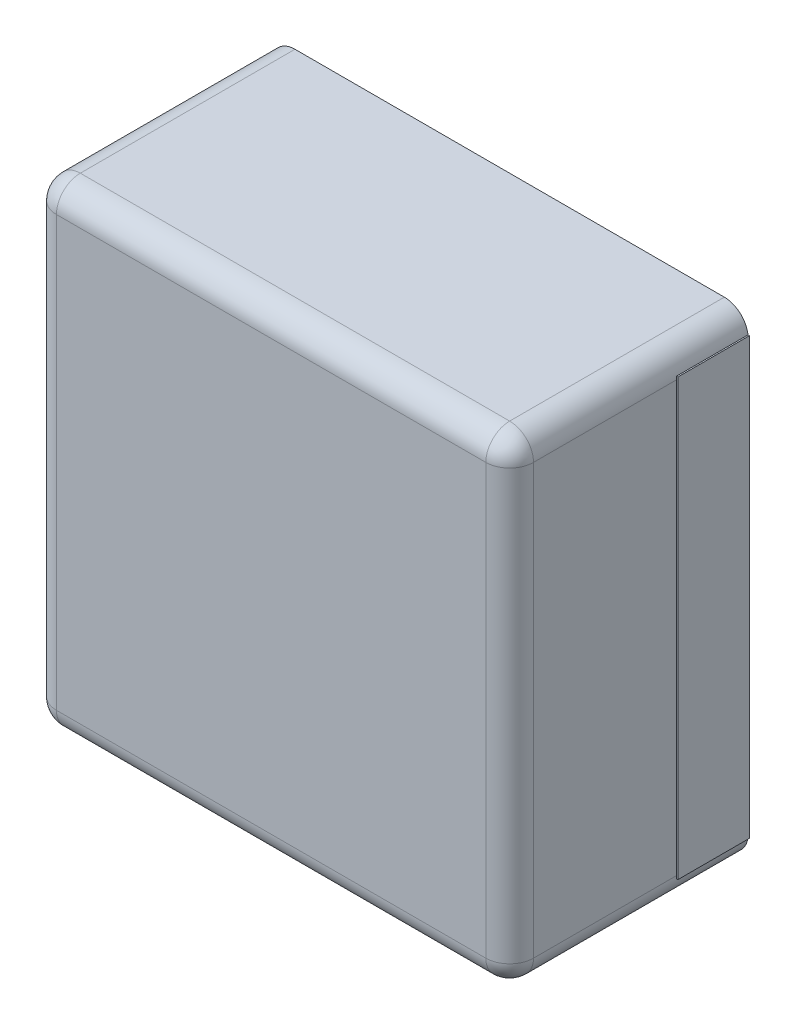
ISO-10303-21;
HEADER;
FILE_DESCRIPTION(('STEP AP214'),'2;1');
FILE_NAME('part.step','',(''),(''),'','','');
FILE_SCHEMA(('AUTOMOTIVE_DESIGN { 1 0 10303 214 1 1 1 1 }'));
ENDSEC;
DATA;
#1=APPLICATION_CONTEXT('core data for automotive mechanical design processes');
#2=APPLICATION_PROTOCOL_DEFINITION('international standard','automotive_design',2000,#1);
#3=PRODUCT_CONTEXT('',#1,'mechanical');
#4=PRODUCT('Part','Part','',(#3));
#5=PRODUCT_RELATED_PRODUCT_CATEGORY('part','',(#4));
#6=PRODUCT_DEFINITION_FORMATION('','',#4);
#7=PRODUCT_DEFINITION_CONTEXT('part definition',#1,'design');
#8=PRODUCT_DEFINITION('design','',#6,#7);
#9=PRODUCT_DEFINITION_SHAPE('','',#8);
#10=(LENGTH_UNIT() NAMED_UNIT(*) SI_UNIT(.MILLI.,.METRE.));
#11=(NAMED_UNIT(*) PLANE_ANGLE_UNIT() SI_UNIT($,.RADIAN.));
#12=(NAMED_UNIT(*) SI_UNIT($,.STERADIAN.) SOLID_ANGLE_UNIT());
#13=UNCERTAINTY_MEASURE_WITH_UNIT(LENGTH_MEASURE(1.E-05),#10,'distance_accuracy_value','');
#14=(GEOMETRIC_REPRESENTATION_CONTEXT(3) GLOBAL_UNCERTAINTY_ASSIGNED_CONTEXT((#13)) GLOBAL_UNIT_ASSIGNED_CONTEXT((#10,
#11,#12)) REPRESENTATION_CONTEXT('',''));
#15=CARTESIAN_POINT('',(0.,0.,0.));
#16=DIRECTION('',(0.,0.,1.));
#17=DIRECTION('',(1.,0.,0.));
#18=AXIS2_PLACEMENT_3D('',#15,#16,#17);
#19=CARTESIAN_POINT('',(2.01,-1.825,0.));
#20=DIRECTION('',(1.,0.,0.));
#21=DIRECTION('',(0.,1.,0.));
#22=AXIS2_PLACEMENT_3D('',#19,#20,#21);
#23=PLANE('',#22);
#24=DIRECTION('',(0.,0.,1.));
#25=VECTOR('',#24,1.);
#26=CARTESIAN_POINT('',(2.01,-1.825,0.));
#27=LINE('',#26,#25);
#28=CARTESIAN_POINT('',(2.01,-1.825,0.));
#29=VERTEX_POINT('',#28);
#30=CARTESIAN_POINT('',(2.01,-1.825,0.6));
#31=VERTEX_POINT('',#30);
#32=EDGE_CURVE('E351',#29,#31,#27,.T.);
#33=ORIENTED_EDGE('',*,*,#32,.F.);
#34=DIRECTION('',(0.,1.,0.));
#35=VECTOR('',#34,1.);
#36=CARTESIAN_POINT('',(2.01,-1.825,0.));
#37=LINE('',#36,#35);
#38=CARTESIAN_POINT('',(2.01,1.825,0.));
#39=VERTEX_POINT('',#38);
#40=EDGE_CURVE('E311',#29,#39,#37,.T.);
#41=ORIENTED_EDGE('',*,*,#40,.T.);
#42=DIRECTION('',(0.,0.,1.));
#43=VECTOR('',#42,1.);
#44=CARTESIAN_POINT('',(2.01,1.825,0.));
#45=LINE('',#44,#43);
#46=CARTESIAN_POINT('',(2.01,1.825,0.6));
#47=VERTEX_POINT('',#46);
#48=EDGE_CURVE('E10',#39,#47,#45,.T.);
#49=ORIENTED_EDGE('',*,*,#48,.T.);
#50=DIRECTION('',(0.,1.,0.));
#51=VECTOR('',#50,1.);
#52=CARTESIAN_POINT('',(2.01,-1.825,0.6));
#53=LINE('',#52,#51);
#54=EDGE_CURVE('E322',#31,#47,#53,.T.);
#55=ORIENTED_EDGE('',*,*,#54,.F.);
#56=EDGE_LOOP('',(#33,#41,#49,#55));
#57=FACE_BOUND('',#56,.T.);
#58=ADVANCED_FACE('F17',(#57),#23,.T.);
#59=CARTESIAN_POINT('',(0.81,1.825,0.));
#60=DIRECTION('',(0.,1.,0.));
#61=DIRECTION('',(1.,0.,0.));
#62=AXIS2_PLACEMENT_3D('',#59,#60,#61);
#63=PLANE('',#62);
#64=DIRECTION('',(1.,0.,0.));
#65=VECTOR('',#64,1.);
#66=CARTESIAN_POINT('',(0.81,1.825,0.));
#67=LINE('',#66,#65);
#68=CARTESIAN_POINT('',(1.99843134833,1.825,0.));
#69=VERTEX_POINT('',#68);
#70=EDGE_CURVE('E362',#69,#39,#67,.T.);
#71=ORIENTED_EDGE('',*,*,#70,.F.);
#72=DIRECTION('',(0.,0.,1.));
#73=VECTOR('',#72,1.);
#74=CARTESIAN_POINT('',(1.99843134833,1.825,0.));
#75=LINE('',#74,#73);
#76=CARTESIAN_POINT('',(1.99843134833,1.825,0.6));
#77=VERTEX_POINT('',#76);
#78=EDGE_CURVE('E218',#69,#77,#75,.T.);
#79=ORIENTED_EDGE('',*,*,#78,.T.);
#80=DIRECTION('',(1.,0.,0.));
#81=VECTOR('',#80,1.);
#82=CARTESIAN_POINT('',(0.81,1.825,0.6));
#83=LINE('',#82,#81);
#84=EDGE_CURVE('E28',#77,#47,#83,.T.);
#85=ORIENTED_EDGE('',*,*,#84,.T.);
#86=ORIENTED_EDGE('',*,*,#48,.F.);
#87=EDGE_LOOP('',(#71,#79,#85,#86));
#88=FACE_BOUND('',#87,.T.);
#89=ADVANCED_FACE('F511',(#88),#63,.T.);
#90=CARTESIAN_POINT('',(1.8,1.8,1.8));
#91=DIRECTION('',(0.,0.,1.));
#92=DIRECTION('',(0.,1.,0.));
#93=AXIS2_PLACEMENT_3D('',#90,#91,#92);
#94=SPHERICAL_SURFACE('',#93,0.2);
#95=CARTESIAN_POINT('',(1.8,1.8,1.8));
#96=DIRECTION('',(0.,-1.,0.));
#97=DIRECTION('',(1.,0.,0.));
#98=AXIS2_PLACEMENT_3D('',#95,#96,#97);
#99=CIRCLE('',#98,0.2);
#100=CARTESIAN_POINT('',(2.,1.8,1.8));
#101=VERTEX_POINT('',#100);
#102=CARTESIAN_POINT('',(1.8,1.8,2.));
#103=VERTEX_POINT('',#102);
#104=EDGE_CURVE('E338',#101,#103,#99,.T.);
#105=ORIENTED_EDGE('',*,*,#104,.F.);
#106=CARTESIAN_POINT('',(1.8,1.8,1.8));
#107=DIRECTION('',(0.,0.,-1.));
#108=DIRECTION('',(0.,1.,0.));
#109=AXIS2_PLACEMENT_3D('',#106,#107,#108);
#110=CIRCLE('',#109,0.2);
#111=CARTESIAN_POINT('',(1.8,2.,1.8));
#112=VERTEX_POINT('',#111);
#113=EDGE_CURVE('E366',#112,#101,#110,.T.);
#114=ORIENTED_EDGE('',*,*,#113,.F.);
#115=CARTESIAN_POINT('',(1.8,1.8,1.8));
#116=DIRECTION('',(1.,0.,0.));
#117=DIRECTION('',(0.,1.,0.));
#118=AXIS2_PLACEMENT_3D('',#115,#116,#117);
#119=CIRCLE('',#118,0.2);
#120=EDGE_CURVE('E159',#112,#103,#119,.T.);
#121=ORIENTED_EDGE('',*,*,#120,.T.);
#122=EDGE_LOOP('',(#105,#114,#121));
#123=FACE_BOUND('',#122,.T.);
#124=ADVANCED_FACE('F465',(#123),#94,.T.);
#125=CARTESIAN_POINT('',(0.81,-1.825,0.6));
#126=DIRECTION('',(0.,0.,1.));
#127=DIRECTION('',(1.,0.,0.));
#128=AXIS2_PLACEMENT_3D('',#125,#126,#127);
#129=PLANE('',#128);
#130=CARTESIAN_POINT('',(1.8,-1.8,0.6));
#131=DIRECTION('',(0.,0.,1.));
#132=DIRECTION('',(1.,0.,0.));
#133=AXIS2_PLACEMENT_3D('',#130,#131,#132);
#134=CIRCLE('',#133,0.2);
#135=CARTESIAN_POINT('',(1.99843134833,-1.825,0.6));
#136=VERTEX_POINT('',#135);
#137=CARTESIAN_POINT('',(2.,-1.8,0.6));
#138=VERTEX_POINT('',#137);
#139=EDGE_CURVE('E278',#136,#138,#134,.T.);
#140=ORIENTED_EDGE('',*,*,#139,.F.);
#141=DIRECTION('',(1.,0.,0.));
#142=VECTOR('',#141,1.);
#143=CARTESIAN_POINT('',(0.81,-1.825,0.6));
#144=LINE('',#143,#142);
#145=EDGE_CURVE('E326',#136,#31,#144,.T.);
#146=ORIENTED_EDGE('',*,*,#145,.T.);
#147=ORIENTED_EDGE('',*,*,#54,.T.);
#148=ORIENTED_EDGE('',*,*,#84,.F.);
#149=CARTESIAN_POINT('',(1.8,1.8,0.6));
#150=DIRECTION('',(0.,0.,1.));
#151=DIRECTION('',(1.,0.,0.));
#152=AXIS2_PLACEMENT_3D('',#149,#150,#151);
#153=CIRCLE('',#152,0.2);
#154=CARTESIAN_POINT('',(2.,1.8,0.6));
#155=VERTEX_POINT('',#154);
#156=EDGE_CURVE('E405',#155,#77,#153,.T.);
#157=ORIENTED_EDGE('',*,*,#156,.F.);
#158=DIRECTION('',(0.,-1.,0.));
#159=VECTOR('',#158,1.);
#160=CARTESIAN_POINT('',(2.,-1.9125,0.6));
#161=LINE('',#160,#159);
#162=EDGE_CURVE('E246',#155,#138,#161,.T.);
#163=ORIENTED_EDGE('',*,*,#162,.T.);
#164=EDGE_LOOP('',(#140,#146,#147,#148,#157,#163));
#165=FACE_BOUND('',#164,.T.);
#166=ADVANCED_FACE('F460',(#165),#129,.T.);
#167=CARTESIAN_POINT('',(0.81,-1.825,0.));
#168=DIRECTION('',(0.,1.,0.));
#169=DIRECTION('',(1.,0.,0.));
#170=AXIS2_PLACEMENT_3D('',#167,#168,#169);
#171=PLANE('',#170);
#172=ORIENTED_EDGE('',*,*,#32,.T.);
#173=ORIENTED_EDGE('',*,*,#145,.F.);
#174=DIRECTION('',(0.,0.,1.));
#175=VECTOR('',#174,1.);
#176=CARTESIAN_POINT('',(1.99843134833,-1.825,0.));
#177=LINE('',#176,#175);
#178=CARTESIAN_POINT('',(1.99843134833,-1.825,0.));
#179=VERTEX_POINT('',#178);
#180=EDGE_CURVE('E257',#179,#136,#177,.T.);
#181=ORIENTED_EDGE('',*,*,#180,.F.);
#182=DIRECTION('',(1.,0.,0.));
#183=VECTOR('',#182,1.);
#184=CARTESIAN_POINT('',(0.81,-1.825,0.));
#185=LINE('',#184,#183);
#186=EDGE_CURVE('E307',#179,#29,#185,.T.);
#187=ORIENTED_EDGE('',*,*,#186,.T.);
#188=EDGE_LOOP('',(#172,#173,#181,#187));
#189=FACE_BOUND('',#188,.T.);
#190=ADVANCED_FACE('F464',(#189),#171,.F.);
#191=CARTESIAN_POINT('',(2.,-2.,0.));
#192=DIRECTION('',(1.,0.,0.));
#193=DIRECTION('',(0.,1.,0.));
#194=AXIS2_PLACEMENT_3D('',#191,#192,#193);
#195=PLANE('',#194);
#196=DIRECTION('',(0.,0.,1.));
#197=VECTOR('',#196,1.);
#198=CARTESIAN_POINT('',(2.,-1.8,0.));
#199=LINE('',#198,#197);
#200=CARTESIAN_POINT('',(2.,-1.8,1.8));
#201=VERTEX_POINT('',#200);
#202=EDGE_CURVE('E282',#138,#201,#199,.T.);
#203=ORIENTED_EDGE('',*,*,#202,.F.);
#204=ORIENTED_EDGE('',*,*,#162,.F.);
#205=DIRECTION('',(0.,0.,1.));
#206=VECTOR('',#205,1.);
#207=CARTESIAN_POINT('',(2.,1.8,0.));
#208=LINE('',#207,#206);
#209=EDGE_CURVE('E21',#155,#101,#208,.T.);
#210=ORIENTED_EDGE('',*,*,#209,.T.);
#211=DIRECTION('',(0.,-1.,0.));
#212=VECTOR('',#211,1.);
#213=CARTESIAN_POINT('',(2.,1.8,1.8));
#214=LINE('',#213,#212);
#215=EDGE_CURVE('E244',#101,#201,#214,.T.);
#216=ORIENTED_EDGE('',*,*,#215,.T.);
#217=EDGE_LOOP('',(#203,#204,#210,#216));
#218=FACE_BOUND('',#217,.T.);
#219=ADVANCED_FACE('F520',(#218),#195,.T.);
#220=CARTESIAN_POINT('',(1.8,-1.8,1.8));
#221=DIRECTION('',(0.,0.,1.));
#222=DIRECTION('',(1.,0.,0.));
#223=AXIS2_PLACEMENT_3D('',#220,#221,#222);
#224=SPHERICAL_SURFACE('',#223,0.2);
#225=CARTESIAN_POINT('',(1.8,-1.8,1.8));
#226=DIRECTION('',(-1.,0.,0.));
#227=DIRECTION('',(0.,-1.,0.));
#228=AXIS2_PLACEMENT_3D('',#225,#226,#227);
#229=CIRCLE('',#228,0.2);
#230=CARTESIAN_POINT('',(1.8,-2.,1.8));
#231=VERTEX_POINT('',#230);
#232=CARTESIAN_POINT('',(1.8,-1.8,2.));
#233=VERTEX_POINT('',#232);
#234=EDGE_CURVE('E258',#231,#233,#229,.T.);
#235=ORIENTED_EDGE('',*,*,#234,.F.);
#236=CARTESIAN_POINT('',(1.8,-1.8,1.8));
#237=DIRECTION('',(0.,0.,-1.));
#238=DIRECTION('',(1.,0.,0.));
#239=AXIS2_PLACEMENT_3D('',#236,#237,#238);
#240=CIRCLE('',#239,0.2);
#241=EDGE_CURVE('E254',#201,#231,#240,.T.);
#242=ORIENTED_EDGE('',*,*,#241,.F.);
#243=CARTESIAN_POINT('',(1.8,-1.8,1.8));
#244=DIRECTION('',(0.,-1.,0.));
#245=DIRECTION('',(1.,0.,0.));
#246=AXIS2_PLACEMENT_3D('',#243,#244,#245);
#247=CIRCLE('',#246,0.2);
#248=EDGE_CURVE('E247',#201,#233,#247,.T.);
#249=ORIENTED_EDGE('',*,*,#248,.T.);
#250=EDGE_LOOP('',(#235,#242,#249));
#251=FACE_BOUND('',#250,.T.);
#252=ADVANCED_FACE('F476',(#251),#224,.T.);
#253=CARTESIAN_POINT('',(1.8,1.8,1.8));
#254=DIRECTION('',(0.,-1.,0.));
#255=DIRECTION('',(1.,0.,0.));
#256=AXIS2_PLACEMENT_3D('',#253,#254,#255);
#257=CYLINDRICAL_SURFACE('',#256,0.2);
#258=ORIENTED_EDGE('',*,*,#104,.T.);
#259=DIRECTION('',(0.,-1.,0.));
#260=VECTOR('',#259,1.);
#261=CARTESIAN_POINT('',(1.8,1.8,2.));
#262=LINE('',#261,#260);
#263=EDGE_CURVE('E265',#103,#233,#262,.T.);
#264=ORIENTED_EDGE('',*,*,#263,.T.);
#265=ORIENTED_EDGE('',*,*,#248,.F.);
#266=ORIENTED_EDGE('',*,*,#215,.F.);
#267=EDGE_LOOP('',(#258,#264,#265,#266));
#268=FACE_BOUND('',#267,.T.);
#269=ADVANCED_FACE('F471',(#268),#257,.T.);
#270=CARTESIAN_POINT('',(-1.8,1.8,1.8));
#271=DIRECTION('',(1.,0.,0.));
#272=DIRECTION('',(0.,1.,0.));
#273=AXIS2_PLACEMENT_3D('',#270,#271,#272);
#274=CYLINDRICAL_SURFACE('',#273,0.2);
#275=CARTESIAN_POINT('',(-1.8,1.8,1.8));
#276=DIRECTION('',(1.,0.,0.));
#277=DIRECTION('',(0.,1.,0.));
#278=AXIS2_PLACEMENT_3D('',#275,#276,#277);
#279=CIRCLE('',#278,0.2);
#280=CARTESIAN_POINT('',(-1.8,2.,1.8));
#281=VERTEX_POINT('',#280);
#282=CARTESIAN_POINT('',(-1.8,1.8,2.));
#283=VERTEX_POINT('',#282);
#284=EDGE_CURVE('E420',#281,#283,#279,.T.);
#285=ORIENTED_EDGE('',*,*,#284,.T.);
#286=DIRECTION('',(1.,0.,0.));
#287=VECTOR('',#286,1.);
#288=CARTESIAN_POINT('',(-1.8,1.8,2.));
#289=LINE('',#288,#287);
#290=EDGE_CURVE('E269',#283,#103,#289,.T.);
#291=ORIENTED_EDGE('',*,*,#290,.T.);
#292=ORIENTED_EDGE('',*,*,#120,.F.);
#293=DIRECTION('',(1.,0.,0.));
#294=VECTOR('',#293,1.);
#295=CARTESIAN_POINT('',(-1.8,2.,1.8));
#296=LINE('',#295,#294);
#297=EDGE_CURVE('E205',#281,#112,#296,.T.);
#298=ORIENTED_EDGE('',*,*,#297,.F.);
#299=EDGE_LOOP('',(#285,#291,#292,#298));
#300=FACE_BOUND('',#299,.T.);
#301=ADVANCED_FACE('F475',(#300),#274,.T.);
#302=CARTESIAN_POINT('',(0.81,-1.825,0.));
#303=DIRECTION('',(0.,0.,1.));
#304=DIRECTION('',(1.,0.,0.));
#305=AXIS2_PLACEMENT_3D('',#302,#303,#304);
#306=PLANE('',#305);
#307=DIRECTION('',(1.,0.,0.));
#308=VECTOR('',#307,1.);
#309=CARTESIAN_POINT('',(0.81,1.825,0.));
#310=LINE('',#309,#308);
#311=CARTESIAN_POINT('',(0.81,1.825,0.));
#312=VERTEX_POINT('',#311);
#313=EDGE_CURVE('E223',#312,#69,#310,.T.);
#314=ORIENTED_EDGE('',*,*,#313,.T.);
#315=ORIENTED_EDGE('',*,*,#70,.T.);
#316=ORIENTED_EDGE('',*,*,#40,.F.);
#317=ORIENTED_EDGE('',*,*,#186,.F.);
#318=DIRECTION('',(1.,0.,0.));
#319=VECTOR('',#318,1.);
#320=CARTESIAN_POINT('',(0.81,-1.825,0.));
#321=LINE('',#320,#319);
#322=CARTESIAN_POINT('',(0.81,-1.825,0.));
#323=VERTEX_POINT('',#322);
#324=EDGE_CURVE('E273',#323,#179,#321,.T.);
#325=ORIENTED_EDGE('',*,*,#324,.F.);
#326=DIRECTION('',(0.,1.,0.));
#327=VECTOR('',#326,1.);
#328=CARTESIAN_POINT('',(0.81,-1.825,0.));
#329=LINE('',#328,#327);
#330=EDGE_CURVE('E242',#323,#312,#329,.T.);
#331=ORIENTED_EDGE('',*,*,#330,.T.);
#332=EDGE_LOOP('',(#314,#315,#316,#317,#325,#331));
#333=FACE_BOUND('',#332,.T.);
#334=ADVANCED_FACE('F503',(#333),#306,.F.);
#335=CARTESIAN_POINT('',(1.8,1.8,0.));
#336=DIRECTION('',(0.,0.,1.));
#337=DIRECTION('',(1.,0.,0.));
#338=AXIS2_PLACEMENT_3D('',#335,#336,#337);
#339=CYLINDRICAL_SURFACE('',#338,0.2);
#340=ORIENTED_EDGE('',*,*,#209,.F.);
#341=ORIENTED_EDGE('',*,*,#156,.T.);
#342=ORIENTED_EDGE('',*,*,#78,.F.);
#343=CARTESIAN_POINT('',(1.8,1.8,0.));
#344=DIRECTION('',(0.,0.,1.));
#345=DIRECTION('',(0.,-1.,0.));
#346=AXIS2_PLACEMENT_3D('',#343,#344,#345);
#347=CIRCLE('',#346,0.2);
#348=CARTESIAN_POINT('',(1.8,2.,0.));
#349=VERTEX_POINT('',#348);
#350=EDGE_CURVE('E213',#69,#349,#347,.T.);
#351=ORIENTED_EDGE('',*,*,#350,.T.);
#352=DIRECTION('',(0.,0.,1.));
#353=VECTOR('',#352,1.);
#354=CARTESIAN_POINT('',(1.8,2.,0.));
#355=LINE('',#354,#353);
#356=EDGE_CURVE('E198',#349,#112,#355,.T.);
#357=ORIENTED_EDGE('',*,*,#356,.T.);
#358=ORIENTED_EDGE('',*,*,#113,.T.);
#359=EDGE_LOOP('',(#340,#341,#342,#351,#357,#358));
#360=FACE_BOUND('',#359,.T.);
#361=ADVANCED_FACE('F215',(#360),#339,.T.);
#362=CARTESIAN_POINT('',(-2.01,-1.825,0.));
#363=DIRECTION('',(0.,0.,1.));
#364=DIRECTION('',(1.,0.,0.));
#365=AXIS2_PLACEMENT_3D('',#362,#363,#364);
#366=PLANE('',#365);
#367=DIRECTION('',(1.,0.,0.));
#368=VECTOR('',#367,1.);
#369=CARTESIAN_POINT('',(-2.01,1.825,0.));
#370=LINE('',#369,#368);
#371=CARTESIAN_POINT('',(-2.01,1.825,0.));
#372=VERTEX_POINT('',#371);
#373=CARTESIAN_POINT('',(-1.99843134833,1.825,0.));
#374=VERTEX_POINT('',#373);
#375=EDGE_CURVE('E209',#372,#374,#370,.T.);
#376=ORIENTED_EDGE('',*,*,#375,.T.);
#377=DIRECTION('',(1.,0.,0.));
#378=VECTOR('',#377,1.);
#379=CARTESIAN_POINT('',(-2.01,1.825,0.));
#380=LINE('',#379,#378);
#381=CARTESIAN_POINT('',(-0.81,1.825,0.));
#382=VERTEX_POINT('',#381);
#383=EDGE_CURVE('E232',#374,#382,#380,.T.);
#384=ORIENTED_EDGE('',*,*,#383,.T.);
#385=DIRECTION('',(0.,1.,0.));
#386=VECTOR('',#385,1.);
#387=CARTESIAN_POINT('',(-0.81,-1.825,0.));
#388=LINE('',#387,#386);
#389=CARTESIAN_POINT('',(-0.81,-1.825,0.));
#390=VERTEX_POINT('',#389);
#391=EDGE_CURVE('E238',#390,#382,#388,.T.);
#392=ORIENTED_EDGE('',*,*,#391,.F.);
#393=DIRECTION('',(1.,0.,0.));
#394=VECTOR('',#393,1.);
#395=CARTESIAN_POINT('',(-2.01,-1.825,0.));
#396=LINE('',#395,#394);
#397=CARTESIAN_POINT('',(-1.99843134833,-1.825,0.));
#398=VERTEX_POINT('',#397);
#399=EDGE_CURVE('E259',#398,#390,#396,.T.);
#400=ORIENTED_EDGE('',*,*,#399,.F.);
#401=DIRECTION('',(1.,0.,0.));
#402=VECTOR('',#401,1.);
#403=CARTESIAN_POINT('',(-2.01,-1.825,0.));
#404=LINE('',#403,#402);
#405=CARTESIAN_POINT('',(-2.01,-1.825,0.));
#406=VERTEX_POINT('',#405);
#407=EDGE_CURVE('E341',#406,#398,#404,.T.);
#408=ORIENTED_EDGE('',*,*,#407,.F.);
#409=DIRECTION('',(0.,1.,0.));
#410=VECTOR('',#409,1.);
#411=CARTESIAN_POINT('',(-2.01,-1.825,0.));
#412=LINE('',#411,#410);
#413=EDGE_CURVE('E169',#406,#372,#412,.T.);
#414=ORIENTED_EDGE('',*,*,#413,.T.);
#415=EDGE_LOOP('',(#376,#384,#392,#400,#408,#414));
#416=FACE_BOUND('',#415,.T.);
#417=ADVANCED_FACE('F502',(#416),#366,.F.);
#418=CARTESIAN_POINT('',(1.8,-1.8,0.));
#419=DIRECTION('',(0.,0.,1.));
#420=DIRECTION('',(1.,0.,0.));
#421=AXIS2_PLACEMENT_3D('',#418,#419,#420);
#422=CYLINDRICAL_SURFACE('',#421,0.2);
#423=ORIENTED_EDGE('',*,*,#241,.T.);
#424=DIRECTION('',(0.,0.,1.));
#425=VECTOR('',#424,1.);
#426=CARTESIAN_POINT('',(1.8,-2.,0.));
#427=LINE('',#426,#425);
#428=CARTESIAN_POINT('',(1.8,-2.,0.));
#429=VERTEX_POINT('',#428);
#430=EDGE_CURVE('E350',#429,#231,#427,.T.);
#431=ORIENTED_EDGE('',*,*,#430,.F.);
#432=CARTESIAN_POINT('',(1.8,-1.8,0.));
#433=DIRECTION('',(0.,0.,-1.));
#434=DIRECTION('',(0.,-1.,0.));
#435=AXIS2_PLACEMENT_3D('',#432,#433,#434);
#436=CIRCLE('',#435,0.2);
#437=EDGE_CURVE('E264',#179,#429,#436,.T.);
#438=ORIENTED_EDGE('',*,*,#437,.F.);
#439=ORIENTED_EDGE('',*,*,#180,.T.);
#440=ORIENTED_EDGE('',*,*,#139,.T.);
#441=ORIENTED_EDGE('',*,*,#202,.T.);
#442=EDGE_LOOP('',(#423,#431,#438,#439,#440,#441));
#443=FACE_BOUND('',#442,.T.);
#444=ADVANCED_FACE('F571',(#443),#422,.T.);
#445=CARTESIAN_POINT('',(1.8,-1.8,1.8));
#446=DIRECTION('',(-1.,0.,0.));
#447=DIRECTION('',(0.,-1.,0.));
#448=AXIS2_PLACEMENT_3D('',#445,#446,#447);
#449=CYLINDRICAL_SURFACE('',#448,0.2);
#450=ORIENTED_EDGE('',*,*,#234,.T.);
#451=DIRECTION('',(-1.,0.,0.));
#452=VECTOR('',#451,1.);
#453=CARTESIAN_POINT('',(1.8,-1.8,2.));
#454=LINE('',#453,#452);
#455=CARTESIAN_POINT('',(-1.8,-1.8,2.));
#456=VERTEX_POINT('',#455);
#457=EDGE_CURVE('E270',#233,#456,#454,.T.);
#458=ORIENTED_EDGE('',*,*,#457,.T.);
#459=CARTESIAN_POINT('',(-1.8,-1.8,1.8));
#460=DIRECTION('',(-1.,0.,0.));
#461=DIRECTION('',(0.,-1.,0.));
#462=AXIS2_PLACEMENT_3D('',#459,#460,#461);
#463=CIRCLE('',#462,0.2);
#464=CARTESIAN_POINT('',(-1.8,-2.,1.8));
#465=VERTEX_POINT('',#464);
#466=EDGE_CURVE('E283',#465,#456,#463,.T.);
#467=ORIENTED_EDGE('',*,*,#466,.F.);
#468=DIRECTION('',(-1.,0.,0.));
#469=VECTOR('',#468,1.);
#470=CARTESIAN_POINT('',(1.8,-2.,1.8));
#471=LINE('',#470,#469);
#472=EDGE_CURVE('E347',#231,#465,#471,.T.);
#473=ORIENTED_EDGE('',*,*,#472,.F.);
#474=EDGE_LOOP('',(#450,#458,#467,#473));
#475=FACE_BOUND('',#474,.T.);
#476=ADVANCED_FACE('F565',(#475),#449,.T.);
#477=CARTESIAN_POINT('',(-2.01,-1.825,0.));
#478=DIRECTION('',(1.,0.,0.));
#479=DIRECTION('',(0.,1.,0.));
#480=AXIS2_PLACEMENT_3D('',#477,#478,#479);
#481=PLANE('',#480);
#482=DIRECTION('',(0.,1.,0.));
#483=VECTOR('',#482,1.);
#484=CARTESIAN_POINT('',(-2.01,-1.825,0.6));
#485=LINE('',#484,#483);
#486=CARTESIAN_POINT('',(-2.01,-1.825,0.6));
#487=VERTEX_POINT('',#486);
#488=CARTESIAN_POINT('',(-2.01,1.825,0.6));
#489=VERTEX_POINT('',#488);
#490=EDGE_CURVE('E296',#487,#489,#485,.T.);
#491=ORIENTED_EDGE('',*,*,#490,.T.);
#492=DIRECTION('',(0.,0.,1.));
#493=VECTOR('',#492,1.);
#494=CARTESIAN_POINT('',(-2.01,1.825,0.));
#495=LINE('',#494,#493);
#496=EDGE_CURVE('E314',#372,#489,#495,.T.);
#497=ORIENTED_EDGE('',*,*,#496,.F.);
#498=ORIENTED_EDGE('',*,*,#413,.F.);
#499=DIRECTION('',(0.,0.,1.));
#500=VECTOR('',#499,1.);
#501=CARTESIAN_POINT('',(-2.01,-1.825,0.));
#502=LINE('',#501,#500);
#503=EDGE_CURVE('E263',#406,#487,#502,.T.);
#504=ORIENTED_EDGE('',*,*,#503,.T.);
#505=EDGE_LOOP('',(#491,#497,#498,#504));
#506=FACE_BOUND('',#505,.T.);
#507=ADVANCED_FACE('F561',(#506),#481,.F.);
#508=CARTESIAN_POINT('',(-2.01,1.825,0.));
#509=DIRECTION('',(0.,1.,0.));
#510=DIRECTION('',(1.,0.,0.));
#511=AXIS2_PLACEMENT_3D('',#508,#509,#510);
#512=PLANE('',#511);
#513=ORIENTED_EDGE('',*,*,#375,.F.);
#514=ORIENTED_EDGE('',*,*,#496,.T.);
#515=DIRECTION('',(1.,0.,0.));
#516=VECTOR('',#515,1.);
#517=CARTESIAN_POINT('',(-2.01,1.825,0.6));
#518=LINE('',#517,#516);
#519=CARTESIAN_POINT('',(-1.99843134833,1.825,0.6));
#520=VERTEX_POINT('',#519);
#521=EDGE_CURVE('E294',#489,#520,#518,.T.);
#522=ORIENTED_EDGE('',*,*,#521,.T.);
#523=DIRECTION('',(0.,0.,1.));
#524=VECTOR('',#523,1.);
#525=CARTESIAN_POINT('',(-1.99843134833,1.825,0.));
#526=LINE('',#525,#524);
#527=EDGE_CURVE('E289',#374,#520,#526,.T.);
#528=ORIENTED_EDGE('',*,*,#527,.F.);
#529=EDGE_LOOP('',(#513,#514,#522,#528));
#530=FACE_BOUND('',#529,.T.);
#531=ADVANCED_FACE('F455',(#530),#512,.T.);
#532=CARTESIAN_POINT('',(-2.,2.,0.));
#533=DIRECTION('',(0.,1.,0.));
#534=DIRECTION('',(1.,0.,0.));
#535=AXIS2_PLACEMENT_3D('',#532,#533,#534);
#536=PLANE('',#535);
#537=DIRECTION('',(0.,0.,1.));
#538=VECTOR('',#537,1.);
#539=CARTESIAN_POINT('',(-1.8,2.,0.));
#540=LINE('',#539,#538);
#541=CARTESIAN_POINT('',(-1.8,2.,0.));
#542=VERTEX_POINT('',#541);
#543=EDGE_CURVE('E389',#542,#281,#540,.T.);
#544=ORIENTED_EDGE('',*,*,#543,.T.);
#545=ORIENTED_EDGE('',*,*,#297,.T.);
#546=ORIENTED_EDGE('',*,*,#356,.F.);
#547=DIRECTION('',(1.,0.,0.));
#548=VECTOR('',#547,1.);
#549=CARTESIAN_POINT('',(-2.,2.,0.));
#550=LINE('',#549,#548);
#551=EDGE_CURVE('E203',#542,#349,#550,.T.);
#552=ORIENTED_EDGE('',*,*,#551,.F.);
#553=EDGE_LOOP('',(#544,#545,#546,#552));
#554=FACE_BOUND('',#553,.T.);
#555=ADVANCED_FACE('F201',(#554),#536,.T.);
#556=CARTESIAN_POINT('',(-1.8,1.8,1.8));
#557=DIRECTION('',(0.,0.,1.));
#558=DIRECTION('',(-1.,0.,0.));
#559=AXIS2_PLACEMENT_3D('',#556,#557,#558);
#560=SPHERICAL_SURFACE('',#559,0.2);
#561=ORIENTED_EDGE('',*,*,#284,.F.);
#562=CARTESIAN_POINT('',(-1.8,1.8,1.8));
#563=DIRECTION('',(0.,0.,-1.));
#564=DIRECTION('',(-1.,0.,0.));
#565=AXIS2_PLACEMENT_3D('',#562,#563,#564);
#566=CIRCLE('',#565,0.2);
#567=CARTESIAN_POINT('',(-2.,1.8,1.8));
#568=VERTEX_POINT('',#567);
#569=EDGE_CURVE('E333',#568,#281,#566,.T.);
#570=ORIENTED_EDGE('',*,*,#569,.F.);
#571=CARTESIAN_POINT('',(-1.8,1.8,1.8));
#572=DIRECTION('',(0.,1.,0.));
#573=DIRECTION('',(-1.,0.,0.));
#574=AXIS2_PLACEMENT_3D('',#571,#572,#573);
#575=CIRCLE('',#574,0.2);
#576=EDGE_CURVE('E329',#568,#283,#575,.T.);
#577=ORIENTED_EDGE('',*,*,#576,.T.);
#578=EDGE_LOOP('',(#561,#570,#577));
#579=FACE_BOUND('',#578,.T.);
#580=ADVANCED_FACE('F454',(#579),#560,.T.);
#581=CARTESIAN_POINT('',(-2.,-2.,2.));
#582=DIRECTION('',(0.,0.,1.));
#583=DIRECTION('',(1.,0.,0.));
#584=AXIS2_PLACEMENT_3D('',#581,#582,#583);
#585=PLANE('',#584);
#586=DIRECTION('',(0.,1.,0.));
#587=VECTOR('',#586,1.);
#588=CARTESIAN_POINT('',(-1.8,-1.8,2.));
#589=LINE('',#588,#587);
#590=EDGE_CURVE('E334',#456,#283,#589,.T.);
#591=ORIENTED_EDGE('',*,*,#590,.F.);
#592=ORIENTED_EDGE('',*,*,#457,.F.);
#593=ORIENTED_EDGE('',*,*,#263,.F.);
#594=ORIENTED_EDGE('',*,*,#290,.F.);
#595=EDGE_LOOP('',(#591,#592,#593,#594));
#596=FACE_BOUND('',#595,.T.);
#597=ADVANCED_FACE('F529',(#596),#585,.T.);
#598=CARTESIAN_POINT('',(-2.01,-1.825,0.));
#599=DIRECTION('',(0.,1.,0.));
#600=DIRECTION('',(1.,0.,0.));
#601=AXIS2_PLACEMENT_3D('',#598,#599,#600);
#602=PLANE('',#601);
#603=DIRECTION('',(0.,0.,1.));
#604=VECTOR('',#603,1.);
#605=CARTESIAN_POINT('',(-1.99843134833,-1.825,0.));
#606=LINE('',#605,#604);
#607=CARTESIAN_POINT('',(-1.99843134833,-1.825,0.6));
#608=VERTEX_POINT('',#607);
#609=EDGE_CURVE('E251',#398,#608,#606,.T.);
#610=ORIENTED_EDGE('',*,*,#609,.T.);
#611=DIRECTION('',(1.,0.,0.));
#612=VECTOR('',#611,1.);
#613=CARTESIAN_POINT('',(-2.01,-1.825,0.6));
#614=LINE('',#613,#612);
#615=EDGE_CURVE('E288',#487,#608,#614,.T.);
#616=ORIENTED_EDGE('',*,*,#615,.F.);
#617=ORIENTED_EDGE('',*,*,#503,.F.);
#618=ORIENTED_EDGE('',*,*,#407,.T.);
#619=EDGE_LOOP('',(#610,#616,#617,#618));
#620=FACE_BOUND('',#619,.T.);
#621=ADVANCED_FACE('F494',(#620),#602,.F.);
#622=CARTESIAN_POINT('',(-2.,-2.,0.));
#623=DIRECTION('',(0.,0.,1.));
#624=DIRECTION('',(1.,0.,0.));
#625=AXIS2_PLACEMENT_3D('',#622,#623,#624);
#626=PLANE('',#625);
#627=ORIENTED_EDGE('',*,*,#391,.T.);
#628=ORIENTED_EDGE('',*,*,#383,.F.);
#629=CARTESIAN_POINT('',(-1.8,1.8,0.));
#630=DIRECTION('',(0.,0.,-1.));
#631=DIRECTION('',(0.,-1.,0.));
#632=AXIS2_PLACEMENT_3D('',#629,#630,#631);
#633=CIRCLE('',#632,0.2);
#634=EDGE_CURVE('E229',#374,#542,#633,.T.);
#635=ORIENTED_EDGE('',*,*,#634,.T.);
#636=ORIENTED_EDGE('',*,*,#551,.T.);
#637=ORIENTED_EDGE('',*,*,#350,.F.);
#638=ORIENTED_EDGE('',*,*,#313,.F.);
#639=ORIENTED_EDGE('',*,*,#330,.F.);
#640=ORIENTED_EDGE('',*,*,#324,.T.);
#641=ORIENTED_EDGE('',*,*,#437,.T.);
#642=DIRECTION('',(1.,0.,0.));
#643=VECTOR('',#642,1.);
#644=CARTESIAN_POINT('',(-2.,-2.,0.));
#645=LINE('',#644,#643);
#646=CARTESIAN_POINT('',(-1.8,-2.,0.));
#647=VERTEX_POINT('',#646);
#648=EDGE_CURVE('E287',#647,#429,#645,.T.);
#649=ORIENTED_EDGE('',*,*,#648,.F.);
#650=CARTESIAN_POINT('',(-1.8,-1.8,0.));
#651=DIRECTION('',(0.,0.,1.));
#652=DIRECTION('',(0.,-1.,0.));
#653=AXIS2_PLACEMENT_3D('',#650,#651,#652);
#654=CIRCLE('',#653,0.2);
#655=EDGE_CURVE('E277',#398,#647,#654,.T.);
#656=ORIENTED_EDGE('',*,*,#655,.F.);
#657=ORIENTED_EDGE('',*,*,#399,.T.);
#658=EDGE_LOOP('',(#627,#628,#635,#636,#637,#638,#639,#640,#641,#649,#656,#657));
#659=FACE_BOUND('',#658,.T.);
#660=ADVANCED_FACE('F226',(#659),#626,.F.);
#661=CARTESIAN_POINT('',(-2.,-2.,0.));
#662=DIRECTION('',(0.,1.,0.));
#663=DIRECTION('',(1.,0.,0.));
#664=AXIS2_PLACEMENT_3D('',#661,#662,#663);
#665=PLANE('',#664);
#666=ORIENTED_EDGE('',*,*,#648,.T.);
#667=ORIENTED_EDGE('',*,*,#430,.T.);
#668=ORIENTED_EDGE('',*,*,#472,.T.);
#669=DIRECTION('',(0.,0.,1.));
#670=VECTOR('',#669,1.);
#671=CARTESIAN_POINT('',(-1.8,-2.,0.));
#672=LINE('',#671,#670);
#673=EDGE_CURVE('E303',#647,#465,#672,.T.);
#674=ORIENTED_EDGE('',*,*,#673,.F.);
#675=EDGE_LOOP('',(#666,#667,#668,#674));
#676=FACE_BOUND('',#675,.T.);
#677=ADVANCED_FACE('F439',(#676),#665,.F.);
#678=CARTESIAN_POINT('',(-1.8,-1.8,1.8));
#679=DIRECTION('',(0.,0.,1.));
#680=DIRECTION('',(0.,-1.,0.));
#681=AXIS2_PLACEMENT_3D('',#678,#679,#680);
#682=SPHERICAL_SURFACE('',#681,0.2);
#683=CARTESIAN_POINT('',(-1.8,-1.8,1.8));
#684=DIRECTION('',(0.,1.,0.));
#685=DIRECTION('',(-1.,0.,0.));
#686=AXIS2_PLACEMENT_3D('',#683,#684,#685);
#687=CIRCLE('',#686,0.2);
#688=CARTESIAN_POINT('',(-2.,-1.8,1.8));
#689=VERTEX_POINT('',#688);
#690=EDGE_CURVE('E302',#689,#456,#687,.T.);
#691=ORIENTED_EDGE('',*,*,#690,.F.);
#692=CARTESIAN_POINT('',(-1.8,-1.8,1.8));
#693=DIRECTION('',(0.,0.,-1.));
#694=DIRECTION('',(0.,-1.,0.));
#695=AXIS2_PLACEMENT_3D('',#692,#693,#694);
#696=CIRCLE('',#695,0.2);
#697=EDGE_CURVE('E298',#465,#689,#696,.T.);
#698=ORIENTED_EDGE('',*,*,#697,.F.);
#699=ORIENTED_EDGE('',*,*,#466,.T.);
#700=EDGE_LOOP('',(#691,#698,#699));
#701=FACE_BOUND('',#700,.T.);
#702=ADVANCED_FACE('F444',(#701),#682,.T.);
#703=CARTESIAN_POINT('',(-2.01,-1.825,0.6));
#704=DIRECTION('',(0.,0.,1.));
#705=DIRECTION('',(1.,0.,0.));
#706=AXIS2_PLACEMENT_3D('',#703,#704,#705);
#707=PLANE('',#706);
#708=ORIENTED_EDGE('',*,*,#521,.F.);
#709=ORIENTED_EDGE('',*,*,#490,.F.);
#710=ORIENTED_EDGE('',*,*,#615,.T.);
#711=CARTESIAN_POINT('',(-1.8,-1.8,0.6));
#712=DIRECTION('',(0.,0.,1.));
#713=DIRECTION('',(-1.,0.,0.));
#714=AXIS2_PLACEMENT_3D('',#711,#712,#713);
#715=CIRCLE('',#714,0.2);
#716=CARTESIAN_POINT('',(-2.,-1.8,0.6));
#717=VERTEX_POINT('',#716);
#718=EDGE_CURVE('E248',#717,#608,#715,.T.);
#719=ORIENTED_EDGE('',*,*,#718,.F.);
#720=DIRECTION('',(0.,-1.,0.));
#721=VECTOR('',#720,1.);
#722=CARTESIAN_POINT('',(-2.,-1.9125,0.6));
#723=LINE('',#722,#721);
#724=CARTESIAN_POINT('',(-2.,1.8,0.6));
#725=VERTEX_POINT('',#724);
#726=EDGE_CURVE('E372',#725,#717,#723,.T.);
#727=ORIENTED_EDGE('',*,*,#726,.F.);
#728=CARTESIAN_POINT('',(-1.8,1.8,0.6));
#729=DIRECTION('',(0.,0.,1.));
#730=DIRECTION('',(-1.,0.,0.));
#731=AXIS2_PLACEMENT_3D('',#728,#729,#730);
#732=CIRCLE('',#731,0.2);
#733=EDGE_CURVE('E293',#520,#725,#732,.T.);
#734=ORIENTED_EDGE('',*,*,#733,.F.);
#735=EDGE_LOOP('',(#708,#709,#710,#719,#727,#734));
#736=FACE_BOUND('',#735,.T.);
#737=ADVANCED_FACE('F591',(#736),#707,.T.);
#738=CARTESIAN_POINT('',(-1.8,1.8,0.));
#739=DIRECTION('',(0.,0.,1.));
#740=DIRECTION('',(-1.,0.,0.));
#741=AXIS2_PLACEMENT_3D('',#738,#739,#740);
#742=CYLINDRICAL_SURFACE('',#741,0.2);
#743=ORIENTED_EDGE('',*,*,#569,.T.);
#744=ORIENTED_EDGE('',*,*,#543,.F.);
#745=ORIENTED_EDGE('',*,*,#634,.F.);
#746=ORIENTED_EDGE('',*,*,#527,.T.);
#747=ORIENTED_EDGE('',*,*,#733,.T.);
#748=DIRECTION('',(0.,0.,1.));
#749=VECTOR('',#748,1.);
#750=CARTESIAN_POINT('',(-2.,1.8,0.));
#751=LINE('',#750,#749);
#752=EDGE_CURVE('E369',#725,#568,#751,.T.);
#753=ORIENTED_EDGE('',*,*,#752,.T.);
#754=EDGE_LOOP('',(#743,#744,#745,#746,#747,#753));
#755=FACE_BOUND('',#754,.T.);
#756=ADVANCED_FACE('F539',(#755),#742,.T.);
#757=CARTESIAN_POINT('',(-1.8,-1.8,1.8));
#758=DIRECTION('',(0.,1.,0.));
#759=DIRECTION('',(-1.,0.,0.));
#760=AXIS2_PLACEMENT_3D('',#757,#758,#759);
#761=CYLINDRICAL_SURFACE('',#760,0.2);
#762=ORIENTED_EDGE('',*,*,#690,.T.);
#763=ORIENTED_EDGE('',*,*,#590,.T.);
#764=ORIENTED_EDGE('',*,*,#576,.F.);
#765=DIRECTION('',(0.,1.,0.));
#766=VECTOR('',#765,1.);
#767=CARTESIAN_POINT('',(-2.,-1.8,1.8));
#768=LINE('',#767,#766);
#769=EDGE_CURVE('E373',#689,#568,#768,.T.);
#770=ORIENTED_EDGE('',*,*,#769,.F.);
#771=EDGE_LOOP('',(#762,#763,#764,#770));
#772=FACE_BOUND('',#771,.T.);
#773=ADVANCED_FACE('F535',(#772),#761,.T.);
#774=CARTESIAN_POINT('',(-1.8,-1.8,0.));
#775=DIRECTION('',(0.,0.,1.));
#776=DIRECTION('',(-1.,0.,0.));
#777=AXIS2_PLACEMENT_3D('',#774,#775,#776);
#778=CYLINDRICAL_SURFACE('',#777,0.2);
#779=DIRECTION('',(0.,0.,1.));
#780=VECTOR('',#779,1.);
#781=CARTESIAN_POINT('',(-2.,-1.8,0.));
#782=LINE('',#781,#780);
#783=EDGE_CURVE('E252',#717,#689,#782,.T.);
#784=ORIENTED_EDGE('',*,*,#783,.F.);
#785=ORIENTED_EDGE('',*,*,#718,.T.);
#786=ORIENTED_EDGE('',*,*,#609,.F.);
#787=ORIENTED_EDGE('',*,*,#655,.T.);
#788=ORIENTED_EDGE('',*,*,#673,.T.);
#789=ORIENTED_EDGE('',*,*,#697,.T.);
#790=EDGE_LOOP('',(#784,#785,#786,#787,#788,#789));
#791=FACE_BOUND('',#790,.T.);
#792=ADVANCED_FACE('F19',(#791),#778,.T.);
#793=CARTESIAN_POINT('',(-2.,-2.,0.));
#794=DIRECTION('',(1.,0.,0.));
#795=DIRECTION('',(0.,1.,0.));
#796=AXIS2_PLACEMENT_3D('',#793,#794,#795);
#797=PLANE('',#796);
#798=ORIENTED_EDGE('',*,*,#769,.T.);
#799=ORIENTED_EDGE('',*,*,#752,.F.);
#800=ORIENTED_EDGE('',*,*,#726,.T.);
#801=ORIENTED_EDGE('',*,*,#783,.T.);
#802=EDGE_LOOP('',(#798,#799,#800,#801));
#803=FACE_BOUND('',#802,.T.);
#804=ADVANCED_FACE('F482',(#803),#797,.F.);
#805=CLOSED_SHELL('',(#58,#89,#124,#166,#190,#219,#252,#269,#301,#334,#361,#417,#444,#476,#507,
#531,#555,#580,#597,#621,#660,#677,#702,#737,#756,#773,#792,#804));
#806=MANIFOLD_SOLID_BREP('B1',#805);
#807=ADVANCED_BREP_SHAPE_REPRESENTATION('',(#18,#806),#14);
#808=SHAPE_DEFINITION_REPRESENTATION(#9,#807);
ENDSEC;
END-ISO-10303-21;
